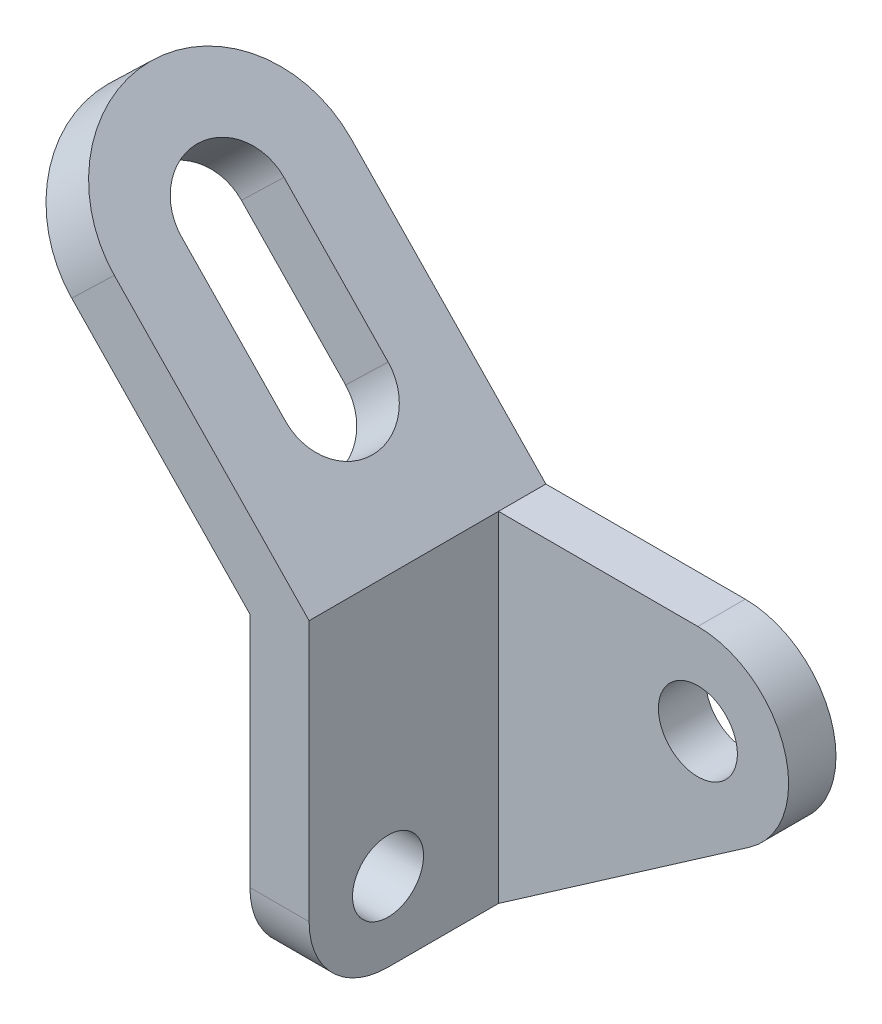
ISO-10303-21;
HEADER;
FILE_DESCRIPTION(('STEP AP214'),'2;1');
FILE_NAME('part.step','',(''),(''),'','','');
FILE_SCHEMA(('AUTOMOTIVE_DESIGN { 1 0 10303 214 1 1 1 1 }'));
ENDSEC;
DATA;
#1=APPLICATION_CONTEXT('core data for automotive mechanical design processes');
#2=APPLICATION_PROTOCOL_DEFINITION('international standard','automotive_design',2000,#1);
#3=PRODUCT_CONTEXT('',#1,'mechanical');
#4=PRODUCT('Part','Part','',(#3));
#5=PRODUCT_RELATED_PRODUCT_CATEGORY('part','',(#4));
#6=PRODUCT_DEFINITION_FORMATION('','',#4);
#7=PRODUCT_DEFINITION_CONTEXT('part definition',#1,'design');
#8=PRODUCT_DEFINITION('design','',#6,#7);
#9=PRODUCT_DEFINITION_SHAPE('','',#8);
#10=(LENGTH_UNIT() NAMED_UNIT(*) SI_UNIT(.MILLI.,.METRE.));
#11=(NAMED_UNIT(*) PLANE_ANGLE_UNIT() SI_UNIT($,.RADIAN.));
#12=(NAMED_UNIT(*) SI_UNIT($,.STERADIAN.) SOLID_ANGLE_UNIT());
#13=UNCERTAINTY_MEASURE_WITH_UNIT(LENGTH_MEASURE(1.E-05),#10,'distance_accuracy_value','');
#14=(GEOMETRIC_REPRESENTATION_CONTEXT(3) GLOBAL_UNCERTAINTY_ASSIGNED_CONTEXT((#13)) GLOBAL_UNIT_ASSIGNED_CONTEXT((#10,
#11,#12)) REPRESENTATION_CONTEXT('',''));
#15=CARTESIAN_POINT('',(0.,0.,0.));
#16=DIRECTION('',(0.,0.,1.));
#17=DIRECTION('',(1.,0.,0.));
#18=AXIS2_PLACEMENT_3D('',#15,#16,#17);
#19=CARTESIAN_POINT('',(58.1493223519375,-21.9857086028853,60.));
#20=DIRECTION('',(-1.,0.,0.));
#21=DIRECTION('',(0.,-1.,0.));
#22=AXIS2_PLACEMENT_3D('',#19,#20,#21);
#23=PLANE('',#22);
#24=CARTESIAN_POINT('',(58.1493223519375,-88.0461019904127,40.));
#25=DIRECTION('',(1.,0.,0.));
#26=DIRECTION('',(0.,1.,0.));
#27=AXIS2_PLACEMENT_3D('',#24,#25,#26);
#28=CIRCLE('',#27,9.00000000000001);
#29=CARTESIAN_POINT('',(58.1493223519375,-79.0461019904127,40.));
#30=VERTEX_POINT('',#29);
#31=EDGE_CURVE('E552',#30,#30,#28,.T.);
#32=ORIENTED_EDGE('',*,*,#31,.F.);
#33=EDGE_LOOP('',(#32));
#34=FACE_BOUND('',#33,.T.);
#35=DIRECTION('',(0.,1.,0.));
#36=VECTOR('',#35,1.);
#37=CARTESIAN_POINT('',(58.1493223519375,-21.9857086028853,60.));
#38=LINE('',#37,#36);
#39=CARTESIAN_POINT('',(58.1493223519375,-88.0461019904127,60.));
#40=VERTEX_POINT('',#39);
#41=CARTESIAN_POINT('',(58.1493223519375,-21.9857086028853,60.));
#42=VERTEX_POINT('',#41);
#43=EDGE_CURVE('E258',#40,#42,#38,.T.);
#44=ORIENTED_EDGE('',*,*,#43,.F.);
#45=CARTESIAN_POINT('',(58.1493223519375,-88.0461019904127,40.));
#46=DIRECTION('',(-1.,0.,0.));
#47=DIRECTION('',(0.,-1.,0.));
#48=AXIS2_PLACEMENT_3D('',#45,#46,#47);
#49=CIRCLE('',#48,20.);
#50=CARTESIAN_POINT('',(58.1493223519375,-108.046101990413,40.));
#51=VERTEX_POINT('',#50);
#52=EDGE_CURVE('E62',#40,#51,#49,.F.);
#53=ORIENTED_EDGE('',*,*,#52,.T.);
#54=DIRECTION('',(0.,0.,-1.));
#55=VECTOR('',#54,1.);
#56=CARTESIAN_POINT('',(58.1493223519375,-108.046101990413,60.));
#57=LINE('',#56,#55);
#58=CARTESIAN_POINT('',(58.1493223519375,-108.046101990413,12.));
#59=VERTEX_POINT('',#58);
#60=EDGE_CURVE('E282',#51,#59,#57,.T.);
#61=ORIENTED_EDGE('',*,*,#60,.T.);
#62=DIRECTION('',(0.,-1.,0.));
#63=VECTOR('',#62,1.);
#64=CARTESIAN_POINT('',(58.1493223519375,0.,12.));
#65=LINE('',#64,#63);
#66=CARTESIAN_POINT('',(58.1493223519375,-21.9857086028853,12.));
#67=VERTEX_POINT('',#66);
#68=EDGE_CURVE('E152',#67,#59,#65,.T.);
#69=ORIENTED_EDGE('',*,*,#68,.F.);
#70=DIRECTION('',(0.,0.,-1.));
#71=VECTOR('',#70,1.);
#72=CARTESIAN_POINT('',(58.1493223519375,-21.9857086028853,60.));
#73=LINE('',#72,#71);
#74=EDGE_CURVE('E265',#42,#67,#73,.T.);
#75=ORIENTED_EDGE('',*,*,#74,.F.);
#76=EDGE_LOOP('',(#44,#53,#61,#69,#75));
#77=FACE_BOUND('',#76,.T.);
#78=ADVANCED_FACE('F39',(#34,#77),#23,.F.);
#79=CARTESIAN_POINT('',(-22.8432228416674,40.291179041759,60.));
#80=DIRECTION('',(0.71933980033865,0.694658370458999,0.));
#81=DIRECTION('',(-0.694658370458999,0.71933980033865,0.));
#82=AXIS2_PLACEMENT_3D('',#79,#80,#81);
#83=PLANE('',#82);
#84=CARTESIAN_POINT('',(-2.00347172789743,18.7109850315995,30.));
#85=DIRECTION('',(0.71933980033865,0.694658370458999,0.));
#86=DIRECTION('',(-0.694658370458999,0.71933980033865,0.));
#87=AXIS2_PLACEMENT_3D('',#84,#85,#86);
#88=CIRCLE('',#87,13.);
#89=CARTESIAN_POINT('',(-2.00347172789743,18.7109850315995,17.));
#90=VERTEX_POINT('',#89);
#91=CARTESIAN_POINT('',(-2.00347172789743,18.7109850315995,43.));
#92=VERTEX_POINT('',#91);
#93=EDGE_CURVE('E241',#90,#92,#88,.T.);
#94=ORIENTED_EDGE('',*,*,#93,.T.);
#95=DIRECTION('',(0.694658370458999,-0.71933980033865,0.));
#96=VECTOR('',#95,1.);
#97=CARTESIAN_POINT('',(-22.8432228416674,40.291179041759,43.));
#98=LINE('',#97,#96);
#99=CARTESIAN_POINT('',(24.3935463495445,-8.62392738126917,43.));
#100=VERTEX_POINT('',#99);
#101=EDGE_CURVE('E245',#92,#100,#98,.T.);
#102=ORIENTED_EDGE('',*,*,#101,.T.);
#103=CARTESIAN_POINT('',(24.3935463495445,-8.62392738126919,30.));
#104=DIRECTION('',(0.71933980033865,0.694658370458999,0.));
#105=DIRECTION('',(-0.694658370458999,0.71933980033865,0.));
#106=AXIS2_PLACEMENT_3D('',#103,#104,#105);
#107=CIRCLE('',#106,13.);
#108=CARTESIAN_POINT('',(24.3935463495445,-8.62392738126917,17.));
#109=VERTEX_POINT('',#108);
#110=EDGE_CURVE('E224',#100,#109,#107,.T.);
#111=ORIENTED_EDGE('',*,*,#110,.T.);
#112=DIRECTION('',(0.694658370458999,-0.71933980033865,0.));
#113=VECTOR('',#112,1.);
#114=CARTESIAN_POINT('',(-22.8432228416674,40.291179041759,17.));
#115=LINE('',#114,#113);
#116=EDGE_CURVE('E237',#90,#109,#115,.T.);
#117=ORIENTED_EDGE('',*,*,#116,.F.);
#118=EDGE_LOOP('',(#94,#102,#111,#117));
#119=FACE_BOUND('',#118,.T.);
#120=CARTESIAN_POINT('',(-2.00347172789743,18.7109850315995,30.));
#121=DIRECTION('',(0.71933980033865,0.694658370458999,0.));
#122=DIRECTION('',(-0.694658370458999,0.71933980033865,0.));
#123=AXIS2_PLACEMENT_3D('',#120,#121,#122);
#124=CIRCLE('',#123,30.);
#125=CARTESIAN_POINT('',(-2.00347172789744,18.7109850315995,60.));
#126=VERTEX_POINT('',#125);
#127=CARTESIAN_POINT('',(-22.8432228416674,40.291179041759,30.));
#128=VERTEX_POINT('',#127);
#129=EDGE_CURVE('E292',#126,#128,#124,.F.);
#130=ORIENTED_EDGE('',*,*,#129,.T.);
#131=CARTESIAN_POINT('',(-2.00347172789744,18.7109850315995,30.));
#132=DIRECTION('',(0.71933980033865,0.694658370458999,0.));
#133=DIRECTION('',(-0.694658370458999,0.71933980033865,0.));
#134=AXIS2_PLACEMENT_3D('',#131,#132,#133);
#135=CIRCLE('',#134,30.);
#136=CARTESIAN_POINT('',(-2.00347172789744,18.7109850315995,0.));
#137=VERTEX_POINT('',#136);
#138=EDGE_CURVE('E295',#128,#137,#135,.F.);
#139=ORIENTED_EDGE('',*,*,#138,.T.);
#140=DIRECTION('',(0.694658370458999,-0.71933980033865,0.));
#141=VECTOR('',#140,1.);
#142=CARTESIAN_POINT('',(-22.8432228416674,40.291179041759,0.));
#143=LINE('',#142,#141);
#144=CARTESIAN_POINT('',(43.1493223519375,-28.0461019904127,0.));
#145=VERTEX_POINT('',#144);
#146=EDGE_CURVE('E266',#137,#145,#143,.T.);
#147=ORIENTED_EDGE('',*,*,#146,.T.);
#148=DIRECTION('',(0.,0.,-1.));
#149=VECTOR('',#148,1.);
#150=CARTESIAN_POINT('',(43.1493223519375,-28.0461019904127,60.));
#151=LINE('',#150,#149);
#152=CARTESIAN_POINT('',(43.1493223519375,-28.0461019904127,60.));
#153=VERTEX_POINT('',#152);
#154=EDGE_CURVE('E288',#153,#145,#151,.T.);
#155=ORIENTED_EDGE('',*,*,#154,.F.);
#156=DIRECTION('',(0.694658370458999,-0.71933980033865,0.));
#157=VECTOR('',#156,1.);
#158=CARTESIAN_POINT('',(-22.8432228416674,40.291179041759,60.));
#159=LINE('',#158,#157);
#160=EDGE_CURVE('E250',#126,#153,#159,.T.);
#161=ORIENTED_EDGE('',*,*,#160,.F.);
#162=EDGE_LOOP('',(#130,#139,#147,#155,#161));
#163=FACE_BOUND('',#162,.T.);
#164=ADVANCED_FACE('F340',(#119,#163),#83,.F.);
#165=CARTESIAN_POINT('',(43.1493223519375,-28.0461019904127,60.));
#166=DIRECTION('',(1.,0.,0.));
#167=DIRECTION('',(0.,0.,-1.));
#168=AXIS2_PLACEMENT_3D('',#165,#166,#167);
#169=PLANE('',#168);
#170=CARTESIAN_POINT('',(43.1493223519375,-88.0461019904127,40.));
#171=DIRECTION('',(1.,0.,0.));
#172=DIRECTION('',(0.,1.,0.));
#173=AXIS2_PLACEMENT_3D('',#170,#171,#172);
#174=CIRCLE('',#173,9.00000000000001);
#175=CARTESIAN_POINT('',(43.1493223519375,-79.0461019904127,40.));
#176=VERTEX_POINT('',#175);
#177=EDGE_CURVE('E190',#176,#176,#174,.T.);
#178=ORIENTED_EDGE('',*,*,#177,.T.);
#179=EDGE_LOOP('',(#178));
#180=FACE_BOUND('',#179,.T.);
#181=DIRECTION('',(0.,0.,-1.));
#182=VECTOR('',#181,1.);
#183=CARTESIAN_POINT('',(43.1493223519375,-108.046101990413,60.));
#184=LINE('',#183,#182);
#185=CARTESIAN_POINT('',(43.1493223519375,-108.046101990413,40.));
#186=VERTEX_POINT('',#185);
#187=CARTESIAN_POINT('',(43.1493223519375,-108.046101990413,0.));
#188=VERTEX_POINT('',#187);
#189=EDGE_CURVE('E285',#186,#188,#184,.T.);
#190=ORIENTED_EDGE('',*,*,#189,.F.);
#191=CARTESIAN_POINT('',(43.1493223519375,-88.0461019904127,40.));
#192=DIRECTION('',(1.,0.,0.));
#193=DIRECTION('',(0.,0.,-1.));
#194=AXIS2_PLACEMENT_3D('',#191,#192,#193);
#195=CIRCLE('',#194,20.);
#196=CARTESIAN_POINT('',(43.1493223519375,-88.0461019904127,60.));
#197=VERTEX_POINT('',#196);
#198=EDGE_CURVE('E11',#186,#197,#195,.F.);
#199=ORIENTED_EDGE('',*,*,#198,.T.);
#200=DIRECTION('',(0.,-1.,0.));
#201=VECTOR('',#200,1.);
#202=CARTESIAN_POINT('',(43.1493223519375,-28.0461019904127,60.));
#203=LINE('',#202,#201);
#204=EDGE_CURVE('E253',#153,#197,#203,.T.);
#205=ORIENTED_EDGE('',*,*,#204,.F.);
#206=ORIENTED_EDGE('',*,*,#154,.T.);
#207=DIRECTION('',(0.,-1.,0.));
#208=VECTOR('',#207,1.);
#209=CARTESIAN_POINT('',(43.1493223519375,-28.0461019904127,0.));
#210=LINE('',#209,#208);
#211=EDGE_CURVE('E269',#145,#188,#210,.T.);
#212=ORIENTED_EDGE('',*,*,#211,.T.);
#213=EDGE_LOOP('',(#190,#199,#205,#206,#212));
#214=FACE_BOUND('',#213,.T.);
#215=ADVANCED_FACE('F345',(#180,#214),#169,.F.);
#216=CARTESIAN_POINT('',(43.1493223519375,-108.046101990413,60.));
#217=DIRECTION('',(0.,1.,0.));
#218=DIRECTION('',(0.,0.,1.));
#219=AXIS2_PLACEMENT_3D('',#216,#217,#218);
#220=PLANE('',#219);
#221=ORIENTED_EDGE('',*,*,#60,.F.);
#222=DIRECTION('',(1.,0.,0.));
#223=VECTOR('',#222,1.);
#224=CARTESIAN_POINT('',(43.1493223519375,-108.046101990413,40.));
#225=LINE('',#224,#223);
#226=EDGE_CURVE('E48',#51,#186,#225,.F.);
#227=ORIENTED_EDGE('',*,*,#226,.T.);
#228=ORIENTED_EDGE('',*,*,#189,.T.);
#229=DIRECTION('',(1.,0.,0.));
#230=VECTOR('',#229,1.);
#231=CARTESIAN_POINT('',(43.1493223519375,-108.046101990413,0.));
#232=LINE('',#231,#230);
#233=CARTESIAN_POINT('',(58.1493223519375,-108.046101990413,0.));
#234=VERTEX_POINT('',#233);
#235=EDGE_CURVE('E273',#188,#234,#232,.T.);
#236=ORIENTED_EDGE('',*,*,#235,.T.);
#237=DIRECTION('',(0.,0.,-1.));
#238=VECTOR('',#237,1.);
#239=CARTESIAN_POINT('',(58.1493223519375,-108.046101990413,12.));
#240=LINE('',#239,#238);
#241=EDGE_CURVE('E166',#59,#234,#240,.T.);
#242=ORIENTED_EDGE('',*,*,#241,.F.);
#243=EDGE_LOOP('',(#221,#227,#228,#236,#242));
#244=FACE_BOUND('',#243,.T.);
#245=ADVANCED_FACE('F368',(#244),#220,.F.);
#246=CARTESIAN_POINT('',(-12.0531258365877,50.711054598644,60.));
#247=DIRECTION('',(-0.71933980033865,-0.694658370458999,0.));
#248=DIRECTION('',(0.694658370458999,-0.71933980033865,0.));
#249=AXIS2_PLACEMENT_3D('',#246,#247,#248);
#250=PLANE('',#249);
#251=CARTESIAN_POINT('',(35.1836433546243,1.79594817561582,30.));
#252=DIRECTION('',(0.71933980033865,0.694658370458999,0.));
#253=DIRECTION('',(-0.694658370458999,0.71933980033865,0.));
#254=AXIS2_PLACEMENT_3D('',#251,#252,#253);
#255=CIRCLE('',#254,13.);
#256=CARTESIAN_POINT('',(35.1836433546243,1.7959481756158,43.));
#257=VERTEX_POINT('',#256);
#258=CARTESIAN_POINT('',(35.1836433546243,1.7959481756158,17.));
#259=VERTEX_POINT('',#258);
#260=EDGE_CURVE('E208',#257,#259,#255,.T.);
#261=ORIENTED_EDGE('',*,*,#260,.F.);
#262=DIRECTION('',(0.694658370458999,-0.71933980033865,0.));
#263=VECTOR('',#262,1.);
#264=CARTESIAN_POINT('',(19.1031944661865,18.447740458953,43.));
#265=LINE('',#264,#263);
#266=CARTESIAN_POINT('',(8.78662527718231,29.1308605884845,43.));
#267=VERTEX_POINT('',#266);
#268=EDGE_CURVE('E200',#267,#257,#265,.T.);
#269=ORIENTED_EDGE('',*,*,#268,.F.);
#270=CARTESIAN_POINT('',(8.78662527718232,29.1308605884845,30.));
#271=DIRECTION('',(0.71933980033865,0.694658370458999,0.));
#272=DIRECTION('',(-0.694658370458999,0.71933980033865,0.));
#273=AXIS2_PLACEMENT_3D('',#270,#271,#272);
#274=CIRCLE('',#273,13.);
#275=CARTESIAN_POINT('',(8.78662527718232,29.1308605884845,17.));
#276=VERTEX_POINT('',#275);
#277=EDGE_CURVE('E216',#276,#267,#274,.T.);
#278=ORIENTED_EDGE('',*,*,#277,.F.);
#279=DIRECTION('',(0.694658370458999,-0.71933980033865,0.));
#280=VECTOR('',#279,1.);
#281=CARTESIAN_POINT('',(19.1031944661865,18.447740458953,17.));
#282=LINE('',#281,#280);
#283=EDGE_CURVE('E212',#276,#259,#282,.T.);
#284=ORIENTED_EDGE('',*,*,#283,.T.);
#285=EDGE_LOOP('',(#261,#269,#278,#284));
#286=FACE_BOUND('',#285,.T.);
#287=DIRECTION('',(-0.694658370458999,0.71933980033865,0.));
#288=VECTOR('',#287,1.);
#289=CARTESIAN_POINT('',(-12.0531258365877,50.711054598644,0.));
#290=LINE('',#289,#288);
#291=CARTESIAN_POINT('',(58.1493223519375,-21.9857086028853,0.));
#292=VERTEX_POINT('',#291);
#293=CARTESIAN_POINT('',(8.78662527718231,29.1308605884845,0.));
#294=VERTEX_POINT('',#293);
#295=EDGE_CURVE('E254',#292,#294,#290,.T.);
#296=ORIENTED_EDGE('',*,*,#295,.T.);
#297=CARTESIAN_POINT('',(8.78662527718231,29.1308605884845,30.));
#298=DIRECTION('',(-0.71933980033865,-0.694658370458999,0.));
#299=DIRECTION('',(0.694658370458999,-0.71933980033865,0.));
#300=AXIS2_PLACEMENT_3D('',#297,#298,#299);
#301=CIRCLE('',#300,30.);
#302=CARTESIAN_POINT('',(-12.0531258365877,50.711054598644,30.));
#303=VERTEX_POINT('',#302);
#304=EDGE_CURVE('E305',#294,#303,#301,.F.);
#305=ORIENTED_EDGE('',*,*,#304,.T.);
#306=CARTESIAN_POINT('',(8.78662527718231,29.1308605884845,30.));
#307=DIRECTION('',(-0.71933980033865,-0.694658370458999,0.));
#308=DIRECTION('',(0.694658370458999,-0.71933980033865,0.));
#309=AXIS2_PLACEMENT_3D('',#306,#307,#308);
#310=CIRCLE('',#309,30.);
#311=CARTESIAN_POINT('',(8.78662527718231,29.1308605884845,60.));
#312=VERTEX_POINT('',#311);
#313=EDGE_CURVE('E302',#303,#312,#310,.F.);
#314=ORIENTED_EDGE('',*,*,#313,.T.);
#315=DIRECTION('',(-0.694658370458999,0.71933980033865,0.));
#316=VECTOR('',#315,1.);
#317=CARTESIAN_POINT('',(-12.0531258365877,50.711054598644,60.));
#318=LINE('',#317,#316);
#319=EDGE_CURVE('E261',#42,#312,#318,.T.);
#320=ORIENTED_EDGE('',*,*,#319,.F.);
#321=ORIENTED_EDGE('',*,*,#74,.T.);
#322=DIRECTION('',(0.,0.,-1.));
#323=VECTOR('',#322,1.);
#324=CARTESIAN_POINT('',(58.1493223519375,-21.9857086028853,12.));
#325=LINE('',#324,#323);
#326=EDGE_CURVE('E201',#67,#292,#325,.T.);
#327=ORIENTED_EDGE('',*,*,#326,.T.);
#328=EDGE_LOOP('',(#296,#305,#314,#320,#321,#327));
#329=FACE_BOUND('',#328,.T.);
#330=ADVANCED_FACE('F330',(#286,#329),#250,.F.);
#331=CARTESIAN_POINT('',(0.,0.,60.));
#332=DIRECTION('',(0.,0.,-1.));
#333=DIRECTION('',(-1.,0.,0.));
#334=AXIS2_PLACEMENT_3D('',#331,#332,#333);
#335=PLANE('',#334);
#336=ORIENTED_EDGE('',*,*,#204,.T.);
#337=DIRECTION('',(1.,0.,0.));
#338=VECTOR('',#337,1.);
#339=CARTESIAN_POINT('',(0.,-88.0461019904127,60.));
#340=LINE('',#339,#338);
#341=EDGE_CURVE('E311',#197,#40,#340,.T.);
#342=ORIENTED_EDGE('',*,*,#341,.T.);
#343=ORIENTED_EDGE('',*,*,#43,.T.);
#344=ORIENTED_EDGE('',*,*,#319,.T.);
#345=DIRECTION('',(-0.71933980033865,-0.694658370458999,0.));
#346=VECTOR('',#345,1.);
#347=CARTESIAN_POINT('',(-10.3165691890041,10.6831201295315,60.));
#348=LINE('',#347,#346);
#349=EDGE_CURVE('E308',#312,#126,#348,.T.);
#350=ORIENTED_EDGE('',*,*,#349,.T.);
#351=ORIENTED_EDGE('',*,*,#160,.T.);
#352=EDGE_LOOP('',(#336,#342,#343,#344,#350,#351));
#353=FACE_BOUND('',#352,.T.);
#354=ADVANCED_FACE('F322',(#353),#335,.F.);
#355=CARTESIAN_POINT('',(0.,0.,0.));
#356=DIRECTION('',(0.,0.,-1.));
#357=DIRECTION('',(-1.,0.,0.));
#358=AXIS2_PLACEMENT_3D('',#355,#356,#357);
#359=PLANE('',#358);
#360=ORIENTED_EDGE('',*,*,#146,.F.);
#361=DIRECTION('',(-0.71933980033865,-0.694658370458999,0.));
#362=VECTOR('',#361,1.);
#363=CARTESIAN_POINT('',(8.78662527718231,29.1308605884845,0.));
#364=LINE('',#363,#362);
#365=EDGE_CURVE('E298',#137,#294,#364,.F.);
#366=ORIENTED_EDGE('',*,*,#365,.T.);
#367=ORIENTED_EDGE('',*,*,#295,.F.);
#368=DIRECTION('',(1.,0.,0.));
#369=VECTOR('',#368,1.);
#370=CARTESIAN_POINT('',(0.,-21.9857086028853,0.));
#371=LINE('',#370,#369);
#372=CARTESIAN_POINT('',(108.674200792304,-21.9857086028853,0.));
#373=VERTEX_POINT('',#372);
#374=EDGE_CURVE('E177',#292,#373,#371,.T.);
#375=ORIENTED_EDGE('',*,*,#374,.T.);
#376=CARTESIAN_POINT('',(108.674200792305,-44.9857086028853,0.));
#377=DIRECTION('',(0.,0.,-1.));
#378=DIRECTION('',(-1.,0.,0.));
#379=AXIS2_PLACEMENT_3D('',#376,#377,#378);
#380=CIRCLE('',#379,23.);
#381=CARTESIAN_POINT('',(121.787629996327,-63.8811571159822,0.));
#382=VERTEX_POINT('',#381);
#383=EDGE_CURVE('E189',#382,#373,#380,.F.);
#384=ORIENTED_EDGE('',*,*,#383,.F.);
#385=DIRECTION('',(0.821541239699841,0.57014909582709,0.));
#386=VECTOR('',#385,1.);
#387=CARTESIAN_POINT('',(69.5115013992031,-100.160756985954,0.));
#388=LINE('',#387,#386);
#389=EDGE_CURVE('E161',#234,#382,#388,.T.);
#390=ORIENTED_EDGE('',*,*,#389,.F.);
#391=ORIENTED_EDGE('',*,*,#235,.F.);
#392=ORIENTED_EDGE('',*,*,#211,.F.);
#393=EDGE_LOOP('',(#360,#366,#367,#375,#384,#390,#391,#392));
#394=FACE_BOUND('',#393,.T.);
#395=CARTESIAN_POINT('',(108.674200792305,-44.9857086028853,0.));
#396=DIRECTION('',(0.,0.,-1.));
#397=DIRECTION('',(-1.,0.,0.));
#398=AXIS2_PLACEMENT_3D('',#395,#396,#397);
#399=CIRCLE('',#398,9.99999999999999);
#400=CARTESIAN_POINT('',(98.6742007923045,-44.9857086028853,0.));
#401=VERTEX_POINT('',#400);
#402=EDGE_CURVE('E185',#401,#401,#399,.T.);
#403=ORIENTED_EDGE('',*,*,#402,.F.);
#404=EDGE_LOOP('',(#403));
#405=FACE_BOUND('',#404,.T.);
#406=ADVANCED_FACE('F379',(#394,#405),#359,.T.);
#407=CARTESIAN_POINT('',(-10.3165691890041,10.6831201295315,30.));
#408=DIRECTION('',(-0.71933980033865,-0.694658370458999,0.));
#409=DIRECTION('',(0.694658370458999,-0.71933980033865,0.));
#410=AXIS2_PLACEMENT_3D('',#407,#408,#409);
#411=CYLINDRICAL_SURFACE('',#410,30.);
#412=ORIENTED_EDGE('',*,*,#349,.F.);
#413=ORIENTED_EDGE('',*,*,#313,.F.);
#414=DIRECTION('',(-0.71933980033865,-0.694658370458999,0.));
#415=VECTOR('',#414,1.);
#416=CARTESIAN_POINT('',(-22.8432228416674,40.291179041759,30.));
#417=LINE('',#416,#415);
#418=EDGE_CURVE('E249',#128,#303,#417,.F.);
#419=ORIENTED_EDGE('',*,*,#418,.F.);
#420=ORIENTED_EDGE('',*,*,#129,.F.);
#421=EDGE_LOOP('',(#412,#413,#419,#420));
#422=FACE_BOUND('',#421,.T.);
#423=ADVANCED_FACE('F336',(#422),#411,.T.);
#424=CARTESIAN_POINT('',(-2.00347172789744,18.7109850315995,30.));
#425=DIRECTION('',(0.71933980033865,0.694658370458999,0.));
#426=DIRECTION('',(-0.694658370458999,0.71933980033865,0.));
#427=AXIS2_PLACEMENT_3D('',#424,#425,#426);
#428=CYLINDRICAL_SURFACE('',#427,30.);
#429=ORIENTED_EDGE('',*,*,#304,.F.);
#430=ORIENTED_EDGE('',*,*,#365,.F.);
#431=ORIENTED_EDGE('',*,*,#138,.F.);
#432=ORIENTED_EDGE('',*,*,#418,.T.);
#433=EDGE_LOOP('',(#429,#430,#431,#432));
#434=FACE_BOUND('',#433,.T.);
#435=ADVANCED_FACE('F374',(#434),#428,.T.);
#436=CARTESIAN_POINT('',(-65.8103615231464,-63.5523273888981,43.));
#437=DIRECTION('',(0.,0.,1.));
#438=DIRECTION('',(0.,-1.,0.));
#439=AXIS2_PLACEMENT_3D('',#436,#437,#438);
#440=PLANE('',#439);
#441=DIRECTION('',(0.71933980033865,0.694658370458999,0.));
#442=VECTOR('',#441,1.);
#443=CARTESIAN_POINT('',(-76.1269307121505,-52.8692072593666,43.));
#444=LINE('',#443,#442);
#445=EDGE_CURVE('E221',#92,#267,#444,.T.);
#446=ORIENTED_EDGE('',*,*,#445,.T.);
#447=ORIENTED_EDGE('',*,*,#268,.T.);
#448=DIRECTION('',(0.71933980033865,0.694658370458999,0.));
#449=VECTOR('',#448,1.);
#450=CARTESIAN_POINT('',(-49.7299126347085,-80.2041196722353,43.));
#451=LINE('',#450,#449);
#452=EDGE_CURVE('E220',#100,#257,#451,.T.);
#453=ORIENTED_EDGE('',*,*,#452,.F.);
#454=ORIENTED_EDGE('',*,*,#101,.F.);
#455=EDGE_LOOP('',(#446,#447,#453,#454));
#456=FACE_BOUND('',#455,.T.);
#457=ADVANCED_FACE('F376',(#456),#440,.F.);
#458=CARTESIAN_POINT('',(-76.1269307121505,-52.8692072593666,30.));
#459=DIRECTION('',(0.71933980033865,0.694658370458999,0.));
#460=DIRECTION('',(-0.694658370458999,0.71933980033865,0.));
#461=AXIS2_PLACEMENT_3D('',#458,#459,#460);
#462=CYLINDRICAL_SURFACE('',#461,13.);
#463=DIRECTION('',(0.71933980033865,0.694658370458999,0.));
#464=VECTOR('',#463,1.);
#465=CARTESIAN_POINT('',(-76.1269307121505,-52.8692072593666,17.));
#466=LINE('',#465,#464);
#467=EDGE_CURVE('E225',#90,#276,#466,.T.);
#468=ORIENTED_EDGE('',*,*,#467,.T.);
#469=ORIENTED_EDGE('',*,*,#277,.T.);
#470=ORIENTED_EDGE('',*,*,#445,.F.);
#471=ORIENTED_EDGE('',*,*,#93,.F.);
#472=EDGE_LOOP('',(#468,#469,#470,#471));
#473=FACE_BOUND('',#472,.T.);
#474=ADVANCED_FACE('F392',(#473),#462,.F.);
#475=CARTESIAN_POINT('',(-65.8103615231464,-63.5523273888981,17.));
#476=DIRECTION('',(0.,0.,1.));
#477=DIRECTION('',(0.,-1.,0.));
#478=AXIS2_PLACEMENT_3D('',#475,#476,#477);
#479=PLANE('',#478);
#480=ORIENTED_EDGE('',*,*,#116,.T.);
#481=DIRECTION('',(0.71933980033865,0.694658370458999,0.));
#482=VECTOR('',#481,1.);
#483=CARTESIAN_POINT('',(-49.7299126347085,-80.2041196722353,17.));
#484=LINE('',#483,#482);
#485=EDGE_CURVE('E228',#109,#259,#484,.T.);
#486=ORIENTED_EDGE('',*,*,#485,.T.);
#487=ORIENTED_EDGE('',*,*,#283,.F.);
#488=ORIENTED_EDGE('',*,*,#467,.F.);
#489=EDGE_LOOP('',(#480,#486,#487,#488));
#490=FACE_BOUND('',#489,.T.);
#491=ADVANCED_FACE('F397',(#490),#479,.T.);
#492=CARTESIAN_POINT('',(-49.7299126347085,-80.2041196722353,30.));
#493=DIRECTION('',(0.71933980033865,0.694658370458999,0.));
#494=DIRECTION('',(-0.694658370458999,0.71933980033865,0.));
#495=AXIS2_PLACEMENT_3D('',#492,#493,#494);
#496=CYLINDRICAL_SURFACE('',#495,13.);
#497=ORIENTED_EDGE('',*,*,#452,.T.);
#498=ORIENTED_EDGE('',*,*,#260,.T.);
#499=ORIENTED_EDGE('',*,*,#485,.F.);
#500=ORIENTED_EDGE('',*,*,#110,.F.);
#501=EDGE_LOOP('',(#497,#498,#499,#500));
#502=FACE_BOUND('',#501,.T.);
#503=ADVANCED_FACE('F394',(#502),#496,.F.);
#504=CARTESIAN_POINT('',(108.674200792305,-44.9857086028853,12.));
#505=DIRECTION('',(0.,0.,-1.));
#506=DIRECTION('',(-1.,0.,0.));
#507=AXIS2_PLACEMENT_3D('',#504,#505,#506);
#508=CYLINDRICAL_SURFACE('',#507,23.);
#509=ORIENTED_EDGE('',*,*,#383,.T.);
#510=DIRECTION('',(0.,0.,-1.));
#511=VECTOR('',#510,1.);
#512=CARTESIAN_POINT('',(108.674200792304,-21.9857086028853,12.));
#513=LINE('',#512,#511);
#514=CARTESIAN_POINT('',(108.674200792304,-21.9857086028853,12.));
#515=VERTEX_POINT('',#514);
#516=EDGE_CURVE('E170',#515,#373,#513,.T.);
#517=ORIENTED_EDGE('',*,*,#516,.F.);
#518=CARTESIAN_POINT('',(108.674200792305,-44.9857086028853,12.));
#519=DIRECTION('',(0.,0.,-1.));
#520=DIRECTION('',(-1.,0.,0.));
#521=AXIS2_PLACEMENT_3D('',#518,#519,#520);
#522=CIRCLE('',#521,23.);
#523=CARTESIAN_POINT('',(121.787629996327,-63.8811571159822,12.));
#524=VERTEX_POINT('',#523);
#525=EDGE_CURVE('E150',#524,#515,#522,.F.);
#526=ORIENTED_EDGE('',*,*,#525,.F.);
#527=DIRECTION('',(0.,0.,-1.));
#528=VECTOR('',#527,1.);
#529=CARTESIAN_POINT('',(121.787629996327,-63.8811571159822,12.));
#530=LINE('',#529,#528);
#531=EDGE_CURVE('E158',#524,#382,#530,.T.);
#532=ORIENTED_EDGE('',*,*,#531,.T.);
#533=EDGE_LOOP('',(#509,#517,#526,#532));
#534=FACE_BOUND('',#533,.T.);
#535=ADVANCED_FACE('F169',(#534),#508,.T.);
#536=CARTESIAN_POINT('',(0.,-21.9857086028853,12.));
#537=DIRECTION('',(0.,1.,0.));
#538=DIRECTION('',(0.,0.,1.));
#539=AXIS2_PLACEMENT_3D('',#536,#537,#538);
#540=PLANE('',#539);
#541=ORIENTED_EDGE('',*,*,#374,.F.);
#542=ORIENTED_EDGE('',*,*,#326,.F.);
#543=DIRECTION('',(1.,0.,0.));
#544=VECTOR('',#543,1.);
#545=CARTESIAN_POINT('',(0.,-21.9857086028853,12.));
#546=LINE('',#545,#544);
#547=EDGE_CURVE('E167',#67,#515,#546,.T.);
#548=ORIENTED_EDGE('',*,*,#547,.T.);
#549=ORIENTED_EDGE('',*,*,#516,.T.);
#550=EDGE_LOOP('',(#541,#542,#548,#549));
#551=FACE_BOUND('',#550,.T.);
#552=ADVANCED_FACE('F408',(#551),#540,.T.);
#553=CARTESIAN_POINT('',(108.674200792305,-44.9857086028853,12.));
#554=DIRECTION('',(0.,0.,-1.));
#555=DIRECTION('',(-1.,0.,0.));
#556=AXIS2_PLACEMENT_3D('',#553,#554,#555);
#557=CYLINDRICAL_SURFACE('',#556,9.99999999999999);
#558=CARTESIAN_POINT('',(108.674200792305,-44.9857086028853,12.));
#559=DIRECTION('',(0.,0.,-1.));
#560=DIRECTION('',(-1.,0.,0.));
#561=AXIS2_PLACEMENT_3D('',#558,#559,#560);
#562=CIRCLE('',#561,9.99999999999999);
#563=CARTESIAN_POINT('',(98.6742007923045,-44.9857086028853,12.));
#564=VERTEX_POINT('',#563);
#565=EDGE_CURVE('E173',#564,#564,#562,.T.);
#566=ORIENTED_EDGE('',*,*,#565,.F.);
#567=EDGE_LOOP('',(#566));
#568=FACE_BOUND('',#567,.T.);
#569=ORIENTED_EDGE('',*,*,#402,.T.);
#570=EDGE_LOOP('',(#569));
#571=FACE_BOUND('',#570,.T.);
#572=ADVANCED_FACE('F405',(#568,#571),#557,.F.);
#573=CARTESIAN_POINT('',(69.5115013992031,-100.160756985954,12.));
#574=DIRECTION('',(-0.57014909582709,0.821541239699841,0.));
#575=DIRECTION('',(-0.821541239699841,-0.57014909582709,0.));
#576=AXIS2_PLACEMENT_3D('',#573,#574,#575);
#577=PLANE('',#576);
#578=ORIENTED_EDGE('',*,*,#389,.T.);
#579=ORIENTED_EDGE('',*,*,#531,.F.);
#580=DIRECTION('',(0.821541239699841,0.57014909582709,0.));
#581=VECTOR('',#580,1.);
#582=CARTESIAN_POINT('',(69.5115013992031,-100.160756985954,12.));
#583=LINE('',#582,#581);
#584=EDGE_CURVE('E145',#59,#524,#583,.T.);
#585=ORIENTED_EDGE('',*,*,#584,.F.);
#586=ORIENTED_EDGE('',*,*,#241,.T.);
#587=EDGE_LOOP('',(#578,#579,#585,#586));
#588=FACE_BOUND('',#587,.T.);
#589=ADVANCED_FACE('F159',(#588),#577,.F.);
#590=CARTESIAN_POINT('',(0.,0.,12.));
#591=DIRECTION('',(0.,0.,-1.));
#592=DIRECTION('',(-1.,0.,0.));
#593=AXIS2_PLACEMENT_3D('',#590,#591,#592);
#594=PLANE('',#593);
#595=ORIENTED_EDGE('',*,*,#565,.T.);
#596=EDGE_LOOP('',(#595));
#597=FACE_BOUND('',#596,.T.);
#598=ORIENTED_EDGE('',*,*,#525,.T.);
#599=ORIENTED_EDGE('',*,*,#547,.F.);
#600=ORIENTED_EDGE('',*,*,#68,.T.);
#601=ORIENTED_EDGE('',*,*,#584,.T.);
#602=EDGE_LOOP('',(#598,#599,#600,#601));
#603=FACE_BOUND('',#602,.T.);
#604=ADVANCED_FACE('F147',(#597,#603),#594,.F.);
#605=CARTESIAN_POINT('',(0.,-88.0461019904127,40.));
#606=DIRECTION('',(1.,0.,0.));
#607=DIRECTION('',(0.,0.,-1.));
#608=AXIS2_PLACEMENT_3D('',#605,#606,#607);
#609=CYLINDRICAL_SURFACE('',#608,20.);
#610=ORIENTED_EDGE('',*,*,#198,.F.);
#611=ORIENTED_EDGE('',*,*,#226,.F.);
#612=ORIENTED_EDGE('',*,*,#52,.F.);
#613=ORIENTED_EDGE('',*,*,#341,.F.);
#614=EDGE_LOOP('',(#610,#611,#612,#613));
#615=FACE_BOUND('',#614,.T.);
#616=ADVANCED_FACE('F41',(#615),#609,.T.);
#617=CARTESIAN_POINT('',(43.1493223519375,-88.0461019904127,40.));
#618=DIRECTION('',(1.,0.,0.));
#619=DIRECTION('',(0.,1.,0.));
#620=AXIS2_PLACEMENT_3D('',#617,#618,#619);
#621=CYLINDRICAL_SURFACE('',#620,9.00000000000001);
#622=ORIENTED_EDGE('',*,*,#177,.F.);
#623=EDGE_LOOP('',(#622));
#624=FACE_BOUND('',#623,.T.);
#625=ORIENTED_EDGE('',*,*,#31,.T.);
#626=EDGE_LOOP('',(#625));
#627=FACE_BOUND('',#626,.T.);
#628=ADVANCED_FACE('F347',(#624,#627),#621,.F.);
#629=CLOSED_SHELL('',(#78,#164,#215,#245,#330,#354,#406,#423,#435,#457,#474,#491,#503,#535,#552,
#572,#589,#604,#616,#628));
#630=MANIFOLD_SOLID_BREP('B2',#629);
#631=ADVANCED_BREP_SHAPE_REPRESENTATION('',(#18,#630),#14);
#632=SHAPE_DEFINITION_REPRESENTATION(#9,#631);
ENDSEC;
END-ISO-10303-21;
